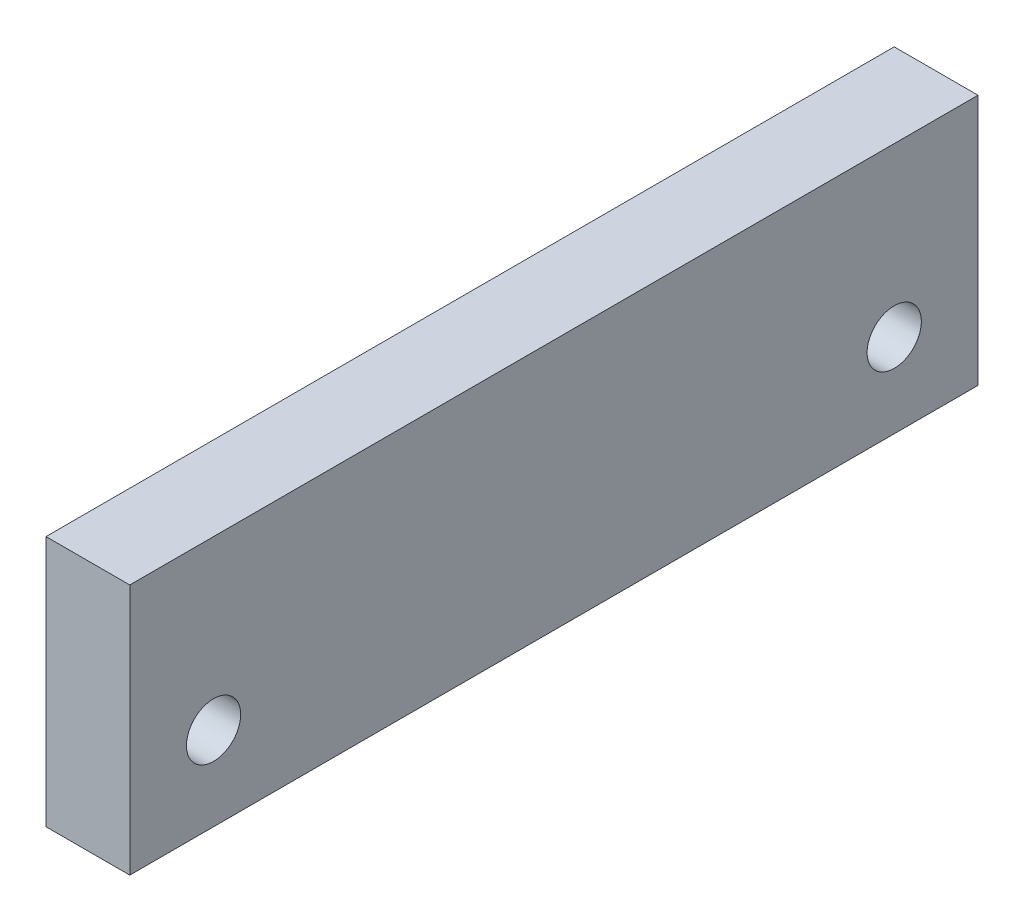
ISO-10303-21;
HEADER;
FILE_DESCRIPTION(('STEP AP214'),'2;1');
FILE_NAME('part.step','',(''),(''),'','','');
FILE_SCHEMA(('AUTOMOTIVE_DESIGN { 1 0 10303 214 1 1 1 1 }'));
ENDSEC;
DATA;
#1=APPLICATION_CONTEXT('core data for automotive mechanical design processes');
#2=APPLICATION_PROTOCOL_DEFINITION('international standard','automotive_design',2000,#1);
#3=PRODUCT_CONTEXT('',#1,'mechanical');
#4=PRODUCT('Part','Part','',(#3));
#5=PRODUCT_RELATED_PRODUCT_CATEGORY('part','',(#4));
#6=PRODUCT_DEFINITION_FORMATION('','',#4);
#7=PRODUCT_DEFINITION_CONTEXT('part definition',#1,'design');
#8=PRODUCT_DEFINITION('design','',#6,#7);
#9=PRODUCT_DEFINITION_SHAPE('','',#8);
#10=(LENGTH_UNIT() NAMED_UNIT(*) SI_UNIT(.MILLI.,.METRE.));
#11=(NAMED_UNIT(*) PLANE_ANGLE_UNIT() SI_UNIT($,.RADIAN.));
#12=(NAMED_UNIT(*) SI_UNIT($,.STERADIAN.) SOLID_ANGLE_UNIT());
#13=UNCERTAINTY_MEASURE_WITH_UNIT(LENGTH_MEASURE(1.E-05),#10,'distance_accuracy_value','');
#14=(GEOMETRIC_REPRESENTATION_CONTEXT(3) GLOBAL_UNCERTAINTY_ASSIGNED_CONTEXT((#13)) GLOBAL_UNIT_ASSIGNED_CONTEXT((#10,
#11,#12)) REPRESENTATION_CONTEXT('',''));
#15=CARTESIAN_POINT('',(0.,0.,0.));
#16=DIRECTION('',(0.,0.,1.));
#17=DIRECTION('',(1.,0.,0.));
#18=AXIS2_PLACEMENT_3D('',#15,#16,#17);
#19=CARTESIAN_POINT('',(12.7,-25.4,128.5875));
#20=DIRECTION('',(1.,0.,0.));
#21=DIRECTION('',(0.,0.,-1.));
#22=AXIS2_PLACEMENT_3D('',#19,#20,#21);
#23=PLANE('',#22);
#24=CARTESIAN_POINT('',(12.7,0.,103.1875));
#25=DIRECTION('',(1.,0.,0.));
#26=DIRECTION('',(0.,0.,-1.));
#27=AXIS2_PLACEMENT_3D('',#24,#25,#26);
#28=CIRCLE('',#27,8.22789634146342);
#29=CARTESIAN_POINT('',(12.7,0.,94.9596036585366));
#30=VERTEX_POINT('',#29);
#31=EDGE_CURVE('E85',#30,#30,#28,.T.);
#32=ORIENTED_EDGE('',*,*,#31,.F.);
#33=EDGE_LOOP('',(#32));
#34=FACE_BOUND('',#33,.T.);
#35=DIRECTION('',(0.,-1.,0.));
#36=VECTOR('',#35,1.);
#37=CARTESIAN_POINT('',(12.7,50.8,128.5875));
#38=LINE('',#37,#36);
#39=CARTESIAN_POINT('',(12.7,50.8,128.5875));
#40=VERTEX_POINT('',#39);
#41=CARTESIAN_POINT('',(12.7,-25.4,128.5875));
#42=VERTEX_POINT('',#41);
#43=EDGE_CURVE('E95',#40,#42,#38,.T.);
#44=ORIENTED_EDGE('',*,*,#43,.T.);
#45=DIRECTION('',(0.,0.,-1.));
#46=VECTOR('',#45,1.);
#47=CARTESIAN_POINT('',(12.7,-25.4,128.5875));
#48=LINE('',#47,#46);
#49=CARTESIAN_POINT('',(12.7,-25.4,-128.5875));
#50=VERTEX_POINT('',#49);
#51=EDGE_CURVE('E80',#42,#50,#48,.T.);
#52=ORIENTED_EDGE('',*,*,#51,.T.);
#53=DIRECTION('',(0.,1.,0.));
#54=VECTOR('',#53,1.);
#55=CARTESIAN_POINT('',(12.7,50.8,-128.5875));
#56=LINE('',#55,#54);
#57=CARTESIAN_POINT('',(12.7,50.8,-128.5875));
#58=VERTEX_POINT('',#57);
#59=EDGE_CURVE('E46',#50,#58,#56,.T.);
#60=ORIENTED_EDGE('',*,*,#59,.T.);
#61=DIRECTION('',(0.,0.,1.));
#62=VECTOR('',#61,1.);
#63=CARTESIAN_POINT('',(12.7,50.8,128.5875));
#64=LINE('',#63,#62);
#65=EDGE_CURVE('E41',#58,#40,#64,.T.);
#66=ORIENTED_EDGE('',*,*,#65,.T.);
#67=EDGE_LOOP('',(#44,#52,#60,#66));
#68=FACE_BOUND('',#67,.T.);
#69=CARTESIAN_POINT('',(12.7,0.,-103.1875));
#70=DIRECTION('',(1.,0.,0.));
#71=DIRECTION('',(0.,0.,-1.));
#72=AXIS2_PLACEMENT_3D('',#69,#70,#71);
#73=CIRCLE('',#72,8.22789634146342);
#74=CARTESIAN_POINT('',(12.7,0.,-111.415396341463));
#75=VERTEX_POINT('',#74);
#76=EDGE_CURVE('E113',#75,#75,#73,.T.);
#77=ORIENTED_EDGE('',*,*,#76,.F.);
#78=EDGE_LOOP('',(#77));
#79=FACE_BOUND('',#78,.T.);
#80=ADVANCED_FACE('F26',(#34,#68,#79),#23,.T.);
#81=CARTESIAN_POINT('',(-12.7,-25.4,128.5875));
#82=DIRECTION('',(1.,0.,0.));
#83=DIRECTION('',(0.,0.,-1.));
#84=AXIS2_PLACEMENT_3D('',#81,#82,#83);
#85=PLANE('',#84);
#86=CARTESIAN_POINT('',(-12.7,0.,103.1875));
#87=DIRECTION('',(1.,0.,0.));
#88=DIRECTION('',(0.,0.,-1.));
#89=AXIS2_PLACEMENT_3D('',#86,#87,#88);
#90=CIRCLE('',#89,8.22789634146342);
#91=CARTESIAN_POINT('',(-12.7,0.,94.9596036585366));
#92=VERTEX_POINT('',#91);
#93=EDGE_CURVE('E88',#92,#92,#90,.T.);
#94=ORIENTED_EDGE('',*,*,#93,.T.);
#95=EDGE_LOOP('',(#94));
#96=FACE_BOUND('',#95,.T.);
#97=DIRECTION('',(0.,-1.,0.));
#98=VECTOR('',#97,1.);
#99=CARTESIAN_POINT('',(-12.7,50.8,128.5875));
#100=LINE('',#99,#98);
#101=CARTESIAN_POINT('',(-12.7,50.8,128.5875));
#102=VERTEX_POINT('',#101);
#103=CARTESIAN_POINT('',(-12.7,-25.4,128.5875));
#104=VERTEX_POINT('',#103);
#105=EDGE_CURVE('E72',#102,#104,#100,.T.);
#106=ORIENTED_EDGE('',*,*,#105,.F.);
#107=DIRECTION('',(0.,0.,1.));
#108=VECTOR('',#107,1.);
#109=CARTESIAN_POINT('',(-12.7,50.8,128.5875));
#110=LINE('',#109,#108);
#111=CARTESIAN_POINT('',(-12.7,50.8,-128.5875));
#112=VERTEX_POINT('',#111);
#113=EDGE_CURVE('E93',#112,#102,#110,.T.);
#114=ORIENTED_EDGE('',*,*,#113,.F.);
#115=DIRECTION('',(0.,1.,0.));
#116=VECTOR('',#115,1.);
#117=CARTESIAN_POINT('',(-12.7,50.8,-128.5875));
#118=LINE('',#117,#116);
#119=CARTESIAN_POINT('',(-12.7,-25.4,-128.5875));
#120=VERTEX_POINT('',#119);
#121=EDGE_CURVE('E73',#120,#112,#118,.T.);
#122=ORIENTED_EDGE('',*,*,#121,.F.);
#123=DIRECTION('',(0.,0.,-1.));
#124=VECTOR('',#123,1.);
#125=CARTESIAN_POINT('',(-12.7,-25.4,128.5875));
#126=LINE('',#125,#124);
#127=EDGE_CURVE('E67',#104,#120,#126,.T.);
#128=ORIENTED_EDGE('',*,*,#127,.F.);
#129=EDGE_LOOP('',(#106,#114,#122,#128));
#130=FACE_BOUND('',#129,.T.);
#131=CARTESIAN_POINT('',(-12.7,0.,-103.1875));
#132=DIRECTION('',(1.,0.,0.));
#133=DIRECTION('',(0.,0.,-1.));
#134=AXIS2_PLACEMENT_3D('',#131,#132,#133);
#135=CIRCLE('',#134,8.22789634146342);
#136=CARTESIAN_POINT('',(-12.7,0.,-111.415396341463));
#137=VERTEX_POINT('',#136);
#138=EDGE_CURVE('E115',#137,#137,#135,.T.);
#139=ORIENTED_EDGE('',*,*,#138,.T.);
#140=EDGE_LOOP('',(#139));
#141=FACE_BOUND('',#140,.T.);
#142=ADVANCED_FACE('F68',(#96,#130,#141),#85,.F.);
#143=CARTESIAN_POINT('',(12.7,50.8,128.5875));
#144=DIRECTION('',(0.,0.,-1.));
#145=DIRECTION('',(0.,1.,0.));
#146=AXIS2_PLACEMENT_3D('',#143,#144,#145);
#147=PLANE('',#146);
#148=ORIENTED_EDGE('',*,*,#105,.T.);
#149=DIRECTION('',(-1.,0.,0.));
#150=VECTOR('',#149,1.);
#151=CARTESIAN_POINT('',(12.7,-25.4,128.5875));
#152=LINE('',#151,#150);
#153=EDGE_CURVE('E11',#42,#104,#152,.T.);
#154=ORIENTED_EDGE('',*,*,#153,.F.);
#155=ORIENTED_EDGE('',*,*,#43,.F.);
#156=DIRECTION('',(-1.,0.,0.));
#157=VECTOR('',#156,1.);
#158=CARTESIAN_POINT('',(12.7,50.8,128.5875));
#159=LINE('',#158,#157);
#160=EDGE_CURVE('E84',#40,#102,#159,.T.);
#161=ORIENTED_EDGE('',*,*,#160,.T.);
#162=EDGE_LOOP('',(#148,#154,#155,#161));
#163=FACE_BOUND('',#162,.T.);
#164=ADVANCED_FACE('F28',(#163),#147,.F.);
#165=CARTESIAN_POINT('',(12.7,-25.4,128.5875));
#166=DIRECTION('',(0.,1.,0.));
#167=DIRECTION('',(0.,0.,1.));
#168=AXIS2_PLACEMENT_3D('',#165,#166,#167);
#169=PLANE('',#168);
#170=ORIENTED_EDGE('',*,*,#127,.T.);
#171=DIRECTION('',(-1.,0.,0.));
#172=VECTOR('',#171,1.);
#173=CARTESIAN_POINT('',(12.7,-25.4,-128.5875));
#174=LINE('',#173,#172);
#175=EDGE_CURVE('E34',#50,#120,#174,.T.);
#176=ORIENTED_EDGE('',*,*,#175,.F.);
#177=ORIENTED_EDGE('',*,*,#51,.F.);
#178=ORIENTED_EDGE('',*,*,#153,.T.);
#179=EDGE_LOOP('',(#170,#176,#177,#178));
#180=FACE_BOUND('',#179,.T.);
#181=ADVANCED_FACE('F79',(#180),#169,.F.);
#182=CARTESIAN_POINT('',(12.7,50.8,-128.5875));
#183=DIRECTION('',(0.,0.,1.));
#184=DIRECTION('',(0.,-1.,0.));
#185=AXIS2_PLACEMENT_3D('',#182,#183,#184);
#186=PLANE('',#185);
#187=ORIENTED_EDGE('',*,*,#121,.T.);
#188=DIRECTION('',(-1.,0.,0.));
#189=VECTOR('',#188,1.);
#190=CARTESIAN_POINT('',(12.7,50.8,-128.5875));
#191=LINE('',#190,#189);
#192=EDGE_CURVE('E101',#58,#112,#191,.T.);
#193=ORIENTED_EDGE('',*,*,#192,.F.);
#194=ORIENTED_EDGE('',*,*,#59,.F.);
#195=ORIENTED_EDGE('',*,*,#175,.T.);
#196=EDGE_LOOP('',(#187,#193,#194,#195));
#197=FACE_BOUND('',#196,.T.);
#198=ADVANCED_FACE('F104',(#197),#186,.F.);
#199=CARTESIAN_POINT('',(12.7,50.8,128.5875));
#200=DIRECTION('',(0.,-1.,0.));
#201=DIRECTION('',(0.,0.,-1.));
#202=AXIS2_PLACEMENT_3D('',#199,#200,#201);
#203=PLANE('',#202);
#204=ORIENTED_EDGE('',*,*,#113,.T.);
#205=ORIENTED_EDGE('',*,*,#160,.F.);
#206=ORIENTED_EDGE('',*,*,#65,.F.);
#207=ORIENTED_EDGE('',*,*,#192,.T.);
#208=EDGE_LOOP('',(#204,#205,#206,#207));
#209=FACE_BOUND('',#208,.T.);
#210=ADVANCED_FACE('F106',(#209),#203,.F.);
#211=CARTESIAN_POINT('',(12.7,0.,103.1875));
#212=DIRECTION('',(-1.,0.,0.));
#213=DIRECTION('',(0.,0.,1.));
#214=AXIS2_PLACEMENT_3D('',#211,#212,#213);
#215=CYLINDRICAL_SURFACE('',#214,8.22789634146342);
#216=ORIENTED_EDGE('',*,*,#31,.T.);
#217=EDGE_LOOP('',(#216));
#218=FACE_BOUND('',#217,.T.);
#219=ORIENTED_EDGE('',*,*,#93,.F.);
#220=EDGE_LOOP('',(#219));
#221=FACE_BOUND('',#220,.T.);
#222=ADVANCED_FACE('F124',(#218,#221),#215,.F.);
#223=CARTESIAN_POINT('',(12.7,0.,-103.1875));
#224=DIRECTION('',(-1.,0.,0.));
#225=DIRECTION('',(0.,0.,1.));
#226=AXIS2_PLACEMENT_3D('',#223,#224,#225);
#227=CYLINDRICAL_SURFACE('',#226,8.22789634146342);
#228=ORIENTED_EDGE('',*,*,#76,.T.);
#229=EDGE_LOOP('',(#228));
#230=FACE_BOUND('',#229,.T.);
#231=ORIENTED_EDGE('',*,*,#138,.F.);
#232=EDGE_LOOP('',(#231));
#233=FACE_BOUND('',#232,.T.);
#234=ADVANCED_FACE('F122',(#230,#233),#227,.F.);
#235=CLOSED_SHELL('',(#80,#142,#164,#181,#198,#210,#222,#234));
#236=MANIFOLD_SOLID_BREP('B2',#235);
#237=ADVANCED_BREP_SHAPE_REPRESENTATION('',(#18,#236),#14);
#238=SHAPE_DEFINITION_REPRESENTATION(#9,#237);
ENDSEC;
END-ISO-10303-21;
